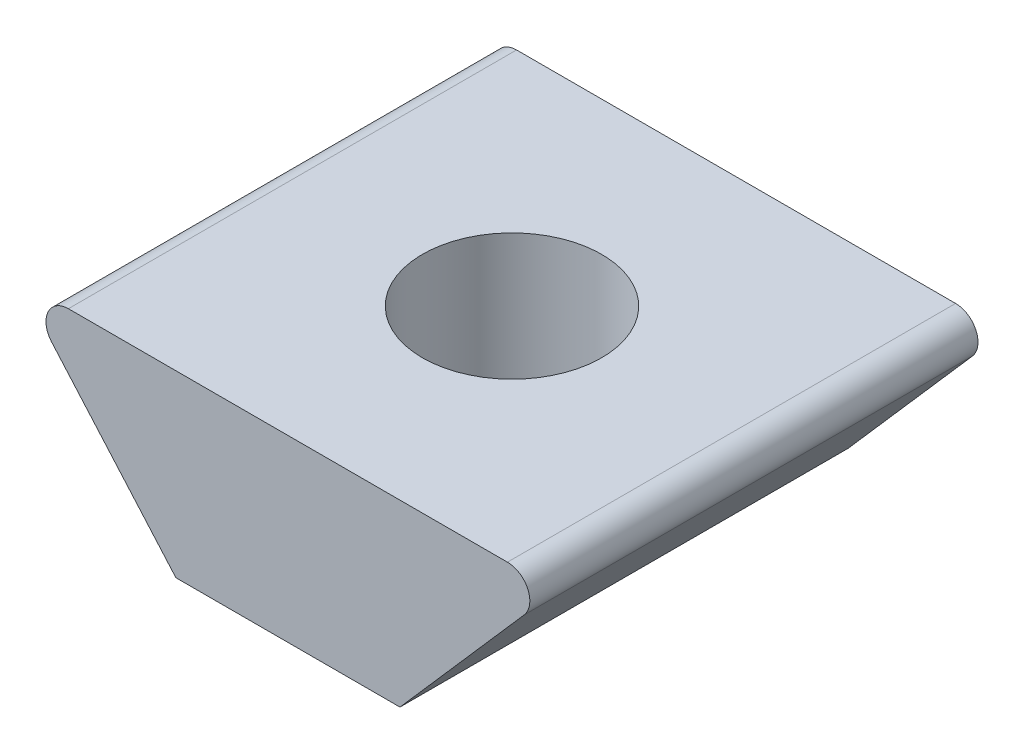
ISO-10303-21;
HEADER;
FILE_DESCRIPTION(('STEP AP214'),'2;1');
FILE_NAME('part.step','',(''),(''),'','','');
FILE_SCHEMA(('AUTOMOTIVE_DESIGN { 1 0 10303 214 1 1 1 1 }'));
ENDSEC;
DATA;
#1=APPLICATION_CONTEXT('core data for automotive mechanical design processes');
#2=APPLICATION_PROTOCOL_DEFINITION('international standard','automotive_design',2000,#1);
#3=PRODUCT_CONTEXT('',#1,'mechanical');
#4=PRODUCT('Part','Part','',(#3));
#5=PRODUCT_RELATED_PRODUCT_CATEGORY('part','',(#4));
#6=PRODUCT_DEFINITION_FORMATION('','',#4);
#7=PRODUCT_DEFINITION_CONTEXT('part definition',#1,'design');
#8=PRODUCT_DEFINITION('design','',#6,#7);
#9=PRODUCT_DEFINITION_SHAPE('','',#8);
#10=(LENGTH_UNIT() NAMED_UNIT(*) SI_UNIT(.MILLI.,.METRE.));
#11=(NAMED_UNIT(*) PLANE_ANGLE_UNIT() SI_UNIT($,.RADIAN.));
#12=(NAMED_UNIT(*) SI_UNIT($,.STERADIAN.) SOLID_ANGLE_UNIT());
#13=UNCERTAINTY_MEASURE_WITH_UNIT(LENGTH_MEASURE(1.E-05),#10,'distance_accuracy_value','');
#14=(GEOMETRIC_REPRESENTATION_CONTEXT(3) GLOBAL_UNCERTAINTY_ASSIGNED_CONTEXT((#13)) GLOBAL_UNIT_ASSIGNED_CONTEXT((#10,
#11,#12)) REPRESENTATION_CONTEXT('',''));
#15=CARTESIAN_POINT('',(0.,0.,0.));
#16=DIRECTION('',(0.,0.,1.));
#17=DIRECTION('',(1.,0.,0.));
#18=AXIS2_PLACEMENT_3D('',#15,#16,#17);
#19=CARTESIAN_POINT('',(6.,4.,10.));
#20=DIRECTION('',(-0.752576694706878,0.658504607868518,0.));
#21=DIRECTION('',(-0.658504607868518,-0.752576694706878,0.));
#22=AXIS2_PLACEMENT_3D('',#19,#20,#21);
#23=PLANE('',#22);
#24=DIRECTION('',(0.658504607868518,0.752576694706878,0.));
#25=VECTOR('',#24,1.);
#26=CARTESIAN_POINT('',(6.,4.,0.));
#27=LINE('',#26,#25);
#28=CARTESIAN_POINT('',(2.5,0.,0.));
#29=VERTEX_POINT('',#28);
#30=CARTESIAN_POINT('',(5.27440423405752,3.17074769606574,0.));
#31=VERTEX_POINT('',#30);
#32=EDGE_CURVE('E129',#29,#31,#27,.T.);
#33=ORIENTED_EDGE('',*,*,#32,.T.);
#34=DIRECTION('',(0.,0.,-1.));
#35=VECTOR('',#34,1.);
#36=CARTESIAN_POINT('',(5.27440423405752,3.17074769606574,10.));
#37=LINE('',#36,#35);
#38=CARTESIAN_POINT('',(5.27440423405752,3.17074769606574,10.));
#39=VERTEX_POINT('',#38);
#40=EDGE_CURVE('E69',#31,#39,#37,.F.);
#41=ORIENTED_EDGE('',*,*,#40,.T.);
#42=DIRECTION('',(0.658504607868518,0.752576694706878,0.));
#43=VECTOR('',#42,1.);
#44=CARTESIAN_POINT('',(6.,4.,10.));
#45=LINE('',#44,#43);
#46=CARTESIAN_POINT('',(2.5,0.,10.));
#47=VERTEX_POINT('',#46);
#48=EDGE_CURVE('E141',#47,#39,#45,.T.);
#49=ORIENTED_EDGE('',*,*,#48,.F.);
#50=DIRECTION('',(0.,0.,-1.));
#51=VECTOR('',#50,1.);
#52=CARTESIAN_POINT('',(2.5,0.,10.));
#53=LINE('',#52,#51);
#54=EDGE_CURVE('E119',#47,#29,#53,.T.);
#55=ORIENTED_EDGE('',*,*,#54,.T.);
#56=EDGE_LOOP('',(#33,#41,#49,#55));
#57=FACE_BOUND('',#56,.T.);
#58=ADVANCED_FACE('F45',(#57),#23,.F.);
#59=CARTESIAN_POINT('',(-6.,4.,10.));
#60=DIRECTION('',(0.,-1.,0.));
#61=DIRECTION('',(0.,0.,-1.));
#62=AXIS2_PLACEMENT_3D('',#59,#60,#61);
#63=PLANE('',#62);
#64=CARTESIAN_POINT('',(0.,4.,5.));
#65=DIRECTION('',(0.,1.,0.));
#66=DIRECTION('',(0.,0.,1.));
#67=AXIS2_PLACEMENT_3D('',#64,#65,#66);
#68=CIRCLE('',#67,2.);
#69=CARTESIAN_POINT('',(0.,4.,7.));
#70=VERTEX_POINT('',#69);
#71=EDGE_CURVE('E175',#70,#70,#68,.T.);
#72=ORIENTED_EDGE('',*,*,#71,.F.);
#73=EDGE_LOOP('',(#72));
#74=FACE_BOUND('',#73,.T.);
#75=DIRECTION('',(-1.,0.,0.));
#76=VECTOR('',#75,1.);
#77=CARTESIAN_POINT('',(-6.,4.,10.));
#78=LINE('',#77,#76);
#79=CARTESIAN_POINT('',(4.89811588670408,4.,10.));
#80=VERTEX_POINT('',#79);
#81=CARTESIAN_POINT('',(-4.89811588670408,4.,10.));
#82=VERTEX_POINT('',#81);
#83=EDGE_CURVE('E108',#80,#82,#78,.T.);
#84=ORIENTED_EDGE('',*,*,#83,.F.);
#85=DIRECTION('',(0.,0.,-1.));
#86=VECTOR('',#85,1.);
#87=CARTESIAN_POINT('',(4.89811588670408,4.,10.));
#88=LINE('',#87,#86);
#89=CARTESIAN_POINT('',(4.89811588670408,4.,0.));
#90=VERTEX_POINT('',#89);
#91=EDGE_CURVE('E145',#80,#90,#88,.T.);
#92=ORIENTED_EDGE('',*,*,#91,.T.);
#93=DIRECTION('',(-1.,0.,0.));
#94=VECTOR('',#93,1.);
#95=CARTESIAN_POINT('',(-6.,4.,0.));
#96=LINE('',#95,#94);
#97=CARTESIAN_POINT('',(-4.89811588670408,4.,0.));
#98=VERTEX_POINT('',#97);
#99=EDGE_CURVE('E132',#90,#98,#96,.T.);
#100=ORIENTED_EDGE('',*,*,#99,.T.);
#101=DIRECTION('',(0.,0.,-1.));
#102=VECTOR('',#101,1.);
#103=CARTESIAN_POINT('',(-4.89811588670408,4.,10.));
#104=LINE('',#103,#102);
#105=EDGE_CURVE('E118',#98,#82,#104,.F.);
#106=ORIENTED_EDGE('',*,*,#105,.T.);
#107=EDGE_LOOP('',(#84,#92,#100,#106));
#108=FACE_BOUND('',#107,.T.);
#109=ADVANCED_FACE('F164',(#74,#108),#63,.F.);
#110=CARTESIAN_POINT('',(-6.,4.,10.));
#111=DIRECTION('',(0.752576694706878,0.658504607868518,0.));
#112=DIRECTION('',(-0.658504607868518,0.752576694706878,0.));
#113=AXIS2_PLACEMENT_3D('',#110,#111,#112);
#114=PLANE('',#113);
#115=DIRECTION('',(0.658504607868518,-0.752576694706878,0.));
#116=VECTOR('',#115,1.);
#117=CARTESIAN_POINT('',(-6.,4.,10.));
#118=LINE('',#117,#116);
#119=CARTESIAN_POINT('',(-5.27440423405752,3.17074769606574,10.));
#120=VERTEX_POINT('',#119);
#121=CARTESIAN_POINT('',(-2.5,0.,10.));
#122=VERTEX_POINT('',#121);
#123=EDGE_CURVE('E99',#120,#122,#118,.T.);
#124=ORIENTED_EDGE('',*,*,#123,.F.);
#125=DIRECTION('',(0.,0.,-1.));
#126=VECTOR('',#125,1.);
#127=CARTESIAN_POINT('',(-5.27440423405752,3.17074769606574,10.));
#128=LINE('',#127,#126);
#129=CARTESIAN_POINT('',(-5.27440423405752,3.17074769606574,0.));
#130=VERTEX_POINT('',#129);
#131=EDGE_CURVE('E11',#120,#130,#128,.T.);
#132=ORIENTED_EDGE('',*,*,#131,.T.);
#133=DIRECTION('',(0.658504607868518,-0.752576694706878,0.));
#134=VECTOR('',#133,1.);
#135=CARTESIAN_POINT('',(-6.,4.,0.));
#136=LINE('',#135,#134);
#137=CARTESIAN_POINT('',(-2.5,0.,0.));
#138=VERTEX_POINT('',#137);
#139=EDGE_CURVE('E114',#130,#138,#136,.T.);
#140=ORIENTED_EDGE('',*,*,#139,.T.);
#141=DIRECTION('',(0.,0.,-1.));
#142=VECTOR('',#141,1.);
#143=CARTESIAN_POINT('',(-2.5,0.,10.));
#144=LINE('',#143,#142);
#145=EDGE_CURVE('E111',#122,#138,#144,.T.);
#146=ORIENTED_EDGE('',*,*,#145,.F.);
#147=EDGE_LOOP('',(#124,#132,#140,#146));
#148=FACE_BOUND('',#147,.T.);
#149=ADVANCED_FACE('F112',(#148),#114,.F.);
#150=CARTESIAN_POINT('',(-2.5,0.,10.));
#151=DIRECTION('',(0.,1.,0.));
#152=DIRECTION('',(-1.,0.,0.));
#153=AXIS2_PLACEMENT_3D('',#150,#151,#152);
#154=PLANE('',#153);
#155=CARTESIAN_POINT('',(0.,0.,5.));
#156=DIRECTION('',(0.,1.,0.));
#157=DIRECTION('',(0.,0.,1.));
#158=AXIS2_PLACEMENT_3D('',#155,#156,#157);
#159=CIRCLE('',#158,2.);
#160=CARTESIAN_POINT('',(0.,0.,7.));
#161=VERTEX_POINT('',#160);
#162=EDGE_CURVE('E133',#161,#161,#159,.T.);
#163=ORIENTED_EDGE('',*,*,#162,.T.);
#164=EDGE_LOOP('',(#163));
#165=FACE_BOUND('',#164,.T.);
#166=DIRECTION('',(1.,0.,0.));
#167=VECTOR('',#166,1.);
#168=CARTESIAN_POINT('',(-2.5,0.,0.));
#169=LINE('',#168,#167);
#170=EDGE_CURVE('E139',#138,#29,#169,.T.);
#171=ORIENTED_EDGE('',*,*,#170,.T.);
#172=ORIENTED_EDGE('',*,*,#54,.F.);
#173=DIRECTION('',(1.,0.,0.));
#174=VECTOR('',#173,1.);
#175=CARTESIAN_POINT('',(-2.5,0.,10.));
#176=LINE('',#175,#174);
#177=EDGE_CURVE('E103',#122,#47,#176,.T.);
#178=ORIENTED_EDGE('',*,*,#177,.F.);
#179=ORIENTED_EDGE('',*,*,#145,.T.);
#180=EDGE_LOOP('',(#171,#172,#178,#179));
#181=FACE_BOUND('',#180,.T.);
#182=ADVANCED_FACE('F121',(#165,#181),#154,.F.);
#183=CARTESIAN_POINT('',(0.,0.,10.));
#184=DIRECTION('',(0.,0.,1.));
#185=DIRECTION('',(1.,0.,0.));
#186=AXIS2_PLACEMENT_3D('',#183,#184,#185);
#187=PLANE('',#186);
#188=ORIENTED_EDGE('',*,*,#48,.T.);
#189=CARTESIAN_POINT('',(4.89811588670408,3.5,10.));
#190=DIRECTION('',(0.,0.,1.));
#191=DIRECTION('',(1.,0.,0.));
#192=AXIS2_PLACEMENT_3D('',#189,#190,#191);
#193=CIRCLE('',#192,0.5);
#194=EDGE_CURVE('E54',#39,#80,#193,.T.);
#195=ORIENTED_EDGE('',*,*,#194,.T.);
#196=ORIENTED_EDGE('',*,*,#83,.T.);
#197=CARTESIAN_POINT('',(-4.89811588670408,3.5,10.));
#198=DIRECTION('',(0.,0.,1.));
#199=DIRECTION('',(1.,0.,0.));
#200=AXIS2_PLACEMENT_3D('',#197,#198,#199);
#201=CIRCLE('',#200,0.5);
#202=EDGE_CURVE('E61',#82,#120,#201,.T.);
#203=ORIENTED_EDGE('',*,*,#202,.T.);
#204=ORIENTED_EDGE('',*,*,#123,.T.);
#205=ORIENTED_EDGE('',*,*,#177,.T.);
#206=EDGE_LOOP('',(#188,#195,#196,#203,#204,#205));
#207=FACE_BOUND('',#206,.T.);
#208=ADVANCED_FACE('F101',(#207),#187,.T.);
#209=CARTESIAN_POINT('',(0.,0.,0.));
#210=DIRECTION('',(0.,0.,1.));
#211=DIRECTION('',(1.,0.,0.));
#212=AXIS2_PLACEMENT_3D('',#209,#210,#211);
#213=PLANE('',#212);
#214=ORIENTED_EDGE('',*,*,#99,.F.);
#215=CARTESIAN_POINT('',(4.89811588670408,3.5,0.));
#216=DIRECTION('',(0.,0.,1.));
#217=DIRECTION('',(1.,0.,0.));
#218=AXIS2_PLACEMENT_3D('',#215,#216,#217);
#219=CIRCLE('',#218,0.5);
#220=EDGE_CURVE('E152',#90,#31,#219,.F.);
#221=ORIENTED_EDGE('',*,*,#220,.T.);
#222=ORIENTED_EDGE('',*,*,#32,.F.);
#223=ORIENTED_EDGE('',*,*,#170,.F.);
#224=ORIENTED_EDGE('',*,*,#139,.F.);
#225=CARTESIAN_POINT('',(-4.89811588670408,3.5,0.));
#226=DIRECTION('',(0.,0.,1.));
#227=DIRECTION('',(1.,0.,0.));
#228=AXIS2_PLACEMENT_3D('',#225,#226,#227);
#229=CIRCLE('',#228,0.5);
#230=EDGE_CURVE('E149',#130,#98,#229,.F.);
#231=ORIENTED_EDGE('',*,*,#230,.T.);
#232=EDGE_LOOP('',(#214,#221,#222,#223,#224,#231));
#233=FACE_BOUND('',#232,.T.);
#234=ADVANCED_FACE('F171',(#233),#213,.F.);
#235=CARTESIAN_POINT('',(0.,0.,5.));
#236=DIRECTION('',(0.,1.,0.));
#237=DIRECTION('',(0.,0.,1.));
#238=AXIS2_PLACEMENT_3D('',#235,#236,#237);
#239=CYLINDRICAL_SURFACE('',#238,2.);
#240=ORIENTED_EDGE('',*,*,#162,.F.);
#241=EDGE_LOOP('',(#240));
#242=FACE_BOUND('',#241,.T.);
#243=ORIENTED_EDGE('',*,*,#71,.T.);
#244=EDGE_LOOP('',(#243));
#245=FACE_BOUND('',#244,.T.);
#246=ADVANCED_FACE('F184',(#242,#245),#239,.F.);
#247=CARTESIAN_POINT('',(4.89811588670408,3.5,10.));
#248=DIRECTION('',(0.,0.,-1.));
#249=DIRECTION('',(-1.,0.,0.));
#250=AXIS2_PLACEMENT_3D('',#247,#248,#249);
#251=CYLINDRICAL_SURFACE('',#250,0.5);
#252=ORIENTED_EDGE('',*,*,#194,.F.);
#253=ORIENTED_EDGE('',*,*,#40,.F.);
#254=ORIENTED_EDGE('',*,*,#220,.F.);
#255=ORIENTED_EDGE('',*,*,#91,.F.);
#256=EDGE_LOOP('',(#252,#253,#254,#255));
#257=FACE_BOUND('',#256,.T.);
#258=ADVANCED_FACE('F168',(#257),#251,.T.);
#259=CARTESIAN_POINT('',(-4.89811588670408,3.5,10.));
#260=DIRECTION('',(0.,0.,-1.));
#261=DIRECTION('',(-1.,0.,0.));
#262=AXIS2_PLACEMENT_3D('',#259,#260,#261);
#263=CYLINDRICAL_SURFACE('',#262,0.5);
#264=ORIENTED_EDGE('',*,*,#202,.F.);
#265=ORIENTED_EDGE('',*,*,#105,.F.);
#266=ORIENTED_EDGE('',*,*,#230,.F.);
#267=ORIENTED_EDGE('',*,*,#131,.F.);
#268=EDGE_LOOP('',(#264,#265,#266,#267));
#269=FACE_BOUND('',#268,.T.);
#270=ADVANCED_FACE('F47',(#269),#263,.T.);
#271=CLOSED_SHELL('',(#58,#109,#149,#182,#208,#234,#246,#258,#270));
#272=MANIFOLD_SOLID_BREP('B2',#271);
#273=ADVANCED_BREP_SHAPE_REPRESENTATION('',(#18,#272),#14);
#274=SHAPE_DEFINITION_REPRESENTATION(#9,#273);
ENDSEC;
END-ISO-10303-21;
